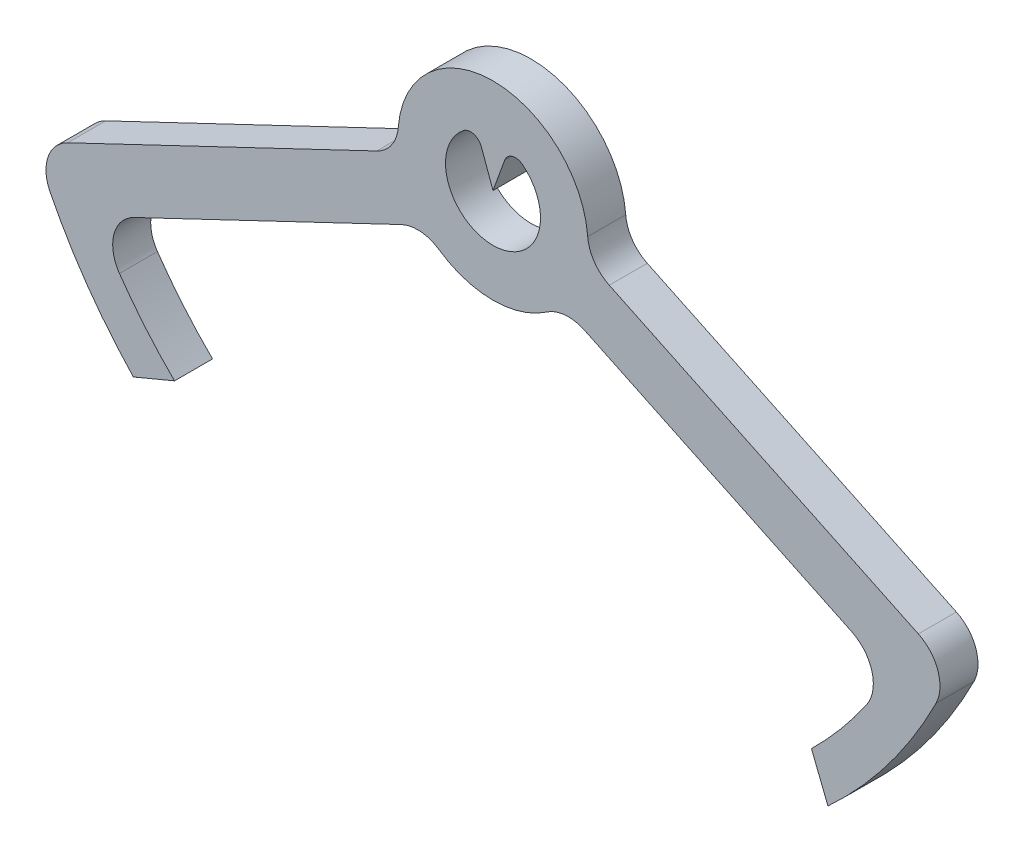
ISO-10303-21;
HEADER;
FILE_DESCRIPTION(('STEP AP214'),'2;1');
FILE_NAME('part.step','',(''),(''),'','','');
FILE_SCHEMA(('AUTOMOTIVE_DESIGN { 1 0 10303 214 1 1 1 1 }'));
ENDSEC;
DATA;
#1=APPLICATION_CONTEXT('core data for automotive mechanical design processes');
#2=APPLICATION_PROTOCOL_DEFINITION('international standard','automotive_design',2000,#1);
#3=PRODUCT_CONTEXT('',#1,'mechanical');
#4=PRODUCT('Part','Part','',(#3));
#5=PRODUCT_RELATED_PRODUCT_CATEGORY('part','',(#4));
#6=PRODUCT_DEFINITION_FORMATION('','',#4);
#7=PRODUCT_DEFINITION_CONTEXT('part definition',#1,'design');
#8=PRODUCT_DEFINITION('design','',#6,#7);
#9=PRODUCT_DEFINITION_SHAPE('','',#8);
#10=(LENGTH_UNIT() NAMED_UNIT(*) SI_UNIT(.MILLI.,.METRE.));
#11=(NAMED_UNIT(*) PLANE_ANGLE_UNIT() SI_UNIT($,.RADIAN.));
#12=(NAMED_UNIT(*) SI_UNIT($,.STERADIAN.) SOLID_ANGLE_UNIT());
#13=UNCERTAINTY_MEASURE_WITH_UNIT(LENGTH_MEASURE(1.E-05),#10,'distance_accuracy_value','');
#14=(GEOMETRIC_REPRESENTATION_CONTEXT(3) GLOBAL_UNCERTAINTY_ASSIGNED_CONTEXT((#13)) GLOBAL_UNIT_ASSIGNED_CONTEXT((#10,
#11,#12)) REPRESENTATION_CONTEXT('',''));
#15=CARTESIAN_POINT('',(0.,0.,0.));
#16=DIRECTION('',(0.,0.,1.));
#17=DIRECTION('',(1.,0.,0.));
#18=AXIS2_PLACEMENT_3D('',#15,#16,#17);
#19=CARTESIAN_POINT('',(0.,0.,10.));
#20=DIRECTION('',(0.,0.,-1.));
#21=DIRECTION('',(-1.,0.,0.));
#22=AXIS2_PLACEMENT_3D('',#19,#20,#21);
#23=CYLINDRICAL_SURFACE('',#22,12.5);
#24=CARTESIAN_POINT('',(0.,0.,10.));
#25=DIRECTION('',(0.,0.,1.));
#26=DIRECTION('',(1.,0.,0.));
#27=AXIS2_PLACEMENT_3D('',#24,#25,#26);
#28=CIRCLE('',#27,12.5);
#29=CARTESIAN_POINT('',(-7.76579706889906,9.79501893232876,10.));
#30=VERTEX_POINT('',#29);
#31=CARTESIAN_POINT('',(7.76579706889912,9.79501893232871,10.));
#32=VERTEX_POINT('',#31);
#33=EDGE_CURVE('E249',#30,#32,#28,.T.);
#34=ORIENTED_EDGE('',*,*,#33,.T.);
#35=DIRECTION('',(0.,0.,-1.));
#36=VECTOR('',#35,1.);
#37=CARTESIAN_POINT('',(7.76579706889912,9.79501893232871,10.));
#38=LINE('',#37,#36);
#39=CARTESIAN_POINT('',(7.76579706889912,9.79501893232871,0.));
#40=VERTEX_POINT('',#39);
#41=EDGE_CURVE('E377',#32,#40,#38,.T.);
#42=ORIENTED_EDGE('',*,*,#41,.T.);
#43=CARTESIAN_POINT('',(0.,0.,0.));
#44=DIRECTION('',(0.,0.,1.));
#45=DIRECTION('',(1.,0.,0.));
#46=AXIS2_PLACEMENT_3D('',#43,#44,#45);
#47=CIRCLE('',#46,12.5);
#48=CARTESIAN_POINT('',(-7.76579706889906,9.79501893232876,0.));
#49=VERTEX_POINT('',#48);
#50=EDGE_CURVE('E287',#49,#40,#47,.T.);
#51=ORIENTED_EDGE('',*,*,#50,.F.);
#52=DIRECTION('',(0.,0.,-1.));
#53=VECTOR('',#52,1.);
#54=CARTESIAN_POINT('',(-7.76579706889906,9.79501893232876,10.));
#55=LINE('',#54,#53);
#56=EDGE_CURVE('E375',#49,#30,#55,.F.);
#57=ORIENTED_EDGE('',*,*,#56,.T.);
#58=EDGE_LOOP('',(#34,#42,#51,#57));
#59=FACE_BOUND('',#58,.T.);
#60=ADVANCED_FACE('F34',(#59),#23,.F.);
#61=CARTESIAN_POINT('',(0.,0.,10.));
#62=DIRECTION('',(0.93969262078591,0.342020143325663,0.));
#63=DIRECTION('',(-0.342020143325663,0.939692620785911,0.));
#64=AXIS2_PLACEMENT_3D('',#61,#62,#63);
#65=PLANE('',#64);
#66=DIRECTION('',(0.342020143325663,-0.939692620785911,0.));
#67=VECTOR('',#66,1.);
#68=CARTESIAN_POINT('',(0.,0.,10.));
#69=LINE('',#68,#67);
#70=CARTESIAN_POINT('',(-3.08292791000555,8.47027481854685,10.));
#71=VERTEX_POINT('',#70);
#72=CARTESIAN_POINT('',(0.,0.,10.));
#73=VERTEX_POINT('',#72);
#74=EDGE_CURVE('E252',#71,#73,#69,.T.);
#75=ORIENTED_EDGE('',*,*,#74,.F.);
#76=DIRECTION('',(0.,0.,-1.));
#77=VECTOR('',#76,1.);
#78=CARTESIAN_POINT('',(-3.08292791000555,8.47027481854685,10.));
#79=LINE('',#78,#77);
#80=CARTESIAN_POINT('',(-3.08292791000555,8.47027481854685,0.));
#81=VERTEX_POINT('',#80);
#82=EDGE_CURVE('E382',#71,#81,#79,.T.);
#83=ORIENTED_EDGE('',*,*,#82,.T.);
#84=DIRECTION('',(0.342020143325663,-0.939692620785911,0.));
#85=VECTOR('',#84,1.);
#86=CARTESIAN_POINT('',(0.,0.,0.));
#87=LINE('',#86,#85);
#88=CARTESIAN_POINT('',(0.,0.,0.));
#89=VERTEX_POINT('',#88);
#90=EDGE_CURVE('E290',#81,#89,#87,.T.);
#91=ORIENTED_EDGE('',*,*,#90,.T.);
#92=DIRECTION('',(0.,0.,-1.));
#93=VECTOR('',#92,1.);
#94=CARTESIAN_POINT('',(0.,0.,10.));
#95=LINE('',#94,#93);
#96=EDGE_CURVE('E211',#73,#89,#95,.T.);
#97=ORIENTED_EDGE('',*,*,#96,.F.);
#98=EDGE_LOOP('',(#75,#83,#91,#97));
#99=FACE_BOUND('',#98,.T.);
#100=ADVANCED_FACE('F395',(#99),#65,.F.);
#101=CARTESIAN_POINT('',(3.22885710080164,-6.76937824490575,10.));
#102=DIRECTION('',(-0.430514280106884,0.90258376598743,0.));
#103=DIRECTION('',(-0.90258376598743,-0.430514280106884,0.));
#104=AXIS2_PLACEMENT_3D('',#101,#102,#103);
#105=PLANE('',#104);
#106=DIRECTION('',(0.90258376598743,0.430514280106884,0.));
#107=VECTOR('',#106,1.);
#108=CARTESIAN_POINT('',(3.22885710080164,-6.76937824490575,10.));
#109=LINE('',#108,#107);
#110=CARTESIAN_POINT('',(-94.3776142828172,-53.325699491744,10.));
#111=VERTEX_POINT('',#110);
#112=CARTESIAN_POINT('',(-24.1292593627974,-19.8186488591643,10.));
#113=VERTEX_POINT('',#112);
#114=EDGE_CURVE('E295',#111,#113,#109,.T.);
#115=ORIENTED_EDGE('',*,*,#114,.F.);
#116=DIRECTION('',(0.,0.,1.));
#117=VECTOR('',#116,1.);
#118=CARTESIAN_POINT('',(-94.3776142828172,-53.325699491744,0.));
#119=LINE('',#118,#117);
#120=CARTESIAN_POINT('',(-94.3776142828172,-53.325699491744,0.));
#121=VERTEX_POINT('',#120);
#122=EDGE_CURVE('E358',#111,#121,#119,.F.);
#123=ORIENTED_EDGE('',*,*,#122,.T.);
#124=DIRECTION('',(0.90258376598743,0.430514280106884,0.));
#125=VECTOR('',#124,1.);
#126=CARTESIAN_POINT('',(3.22885710080164,-6.76937824490575,0.));
#127=LINE('',#126,#125);
#128=CARTESIAN_POINT('',(-24.1292593627974,-19.8186488591643,0.));
#129=VERTEX_POINT('',#128);
#130=EDGE_CURVE('E258',#121,#129,#127,.T.);
#131=ORIENTED_EDGE('',*,*,#130,.T.);
#132=DIRECTION('',(0.,0.,1.));
#133=VECTOR('',#132,1.);
#134=CARTESIAN_POINT('',(-24.1292593627974,-19.8186488591643,10.));
#135=LINE('',#134,#133);
#136=EDGE_CURVE('E307',#129,#113,#135,.T.);
#137=ORIENTED_EDGE('',*,*,#136,.T.);
#138=EDGE_LOOP('',(#115,#123,#131,#137));
#139=FACE_BOUND('',#138,.T.);
#140=ADVANCED_FACE('F418',(#139),#105,.F.);
#141=CARTESIAN_POINT('',(0.,0.,10.));
#142=DIRECTION('',(0.,0.,-1.));
#143=DIRECTION('',(-1.,0.,0.));
#144=AXIS2_PLACEMENT_3D('',#141,#142,#143);
#145=CYLINDRICAL_SURFACE('',#144,25.);
#146=CARTESIAN_POINT('',(0.,0.,10.));
#147=DIRECTION('',(0.,0.,1.));
#148=DIRECTION('',(1.,0.,0.));
#149=AXIS2_PLACEMENT_3D('',#146,#147,#148);
#150=CIRCLE('',#149,25.);
#151=CARTESIAN_POINT('',(-14.1600832583775,-20.6032046564562,10.));
#152=VERTEX_POINT('',#151);
#153=CARTESIAN_POINT('',(14.1600832583774,-20.6032046564562,10.));
#154=VERTEX_POINT('',#153);
#155=EDGE_CURVE('E229',#152,#154,#150,.T.);
#156=ORIENTED_EDGE('',*,*,#155,.F.);
#157=DIRECTION('',(0.,0.,-1.));
#158=VECTOR('',#157,1.);
#159=CARTESIAN_POINT('',(-14.1600832583775,-20.6032046564562,10.));
#160=LINE('',#159,#158);
#161=CARTESIAN_POINT('',(-14.1600832583775,-20.6032046564562,0.));
#162=VERTEX_POINT('',#161);
#163=EDGE_CURVE('E304',#152,#162,#160,.T.);
#164=ORIENTED_EDGE('',*,*,#163,.T.);
#165=CARTESIAN_POINT('',(0.,0.,0.));
#166=DIRECTION('',(0.,0.,1.));
#167=DIRECTION('',(1.,0.,0.));
#168=AXIS2_PLACEMENT_3D('',#165,#166,#167);
#169=CIRCLE('',#168,25.);
#170=CARTESIAN_POINT('',(14.1600832583774,-20.6032046564562,0.));
#171=VERTEX_POINT('',#170);
#172=EDGE_CURVE('E260',#162,#171,#169,.T.);
#173=ORIENTED_EDGE('',*,*,#172,.T.);
#174=DIRECTION('',(0.,0.,-1.));
#175=VECTOR('',#174,1.);
#176=CARTESIAN_POINT('',(14.1600832583774,-20.6032046564562,10.));
#177=LINE('',#176,#175);
#178=EDGE_CURVE('E298',#171,#154,#177,.F.);
#179=ORIENTED_EDGE('',*,*,#178,.T.);
#180=EDGE_LOOP('',(#156,#164,#173,#179));
#181=FACE_BOUND('',#180,.T.);
#182=ADVANCED_FACE('F443',(#181),#145,.T.);
#183=CARTESIAN_POINT('',(-3.22885710080168,-6.76937824490571,10.));
#184=DIRECTION('',(0.43051428010689,0.902583765987427,0.));
#185=DIRECTION('',(-0.902583765987427,0.43051428010689,0.));
#186=AXIS2_PLACEMENT_3D('',#183,#184,#185);
#187=PLANE('',#186);
#188=DIRECTION('',(0.902583765987427,-0.43051428010689,0.));
#189=VECTOR('',#188,1.);
#190=CARTESIAN_POINT('',(-3.22885710080168,-6.76937824490571,0.));
#191=LINE('',#190,#189);
#192=CARTESIAN_POINT('',(24.1292593627972,-19.8186488591645,0.));
#193=VERTEX_POINT('',#192);
#194=CARTESIAN_POINT('',(94.3776142828168,-53.3256994917446,0.));
#195=VERTEX_POINT('',#194);
#196=EDGE_CURVE('E266',#193,#195,#191,.T.);
#197=ORIENTED_EDGE('',*,*,#196,.T.);
#198=DIRECTION('',(0.,0.,-1.));
#199=VECTOR('',#198,1.);
#200=CARTESIAN_POINT('',(94.3776142828168,-53.3256994917446,10.));
#201=LINE('',#200,#199);
#202=CARTESIAN_POINT('',(94.3776142828168,-53.3256994917446,10.));
#203=VERTEX_POINT('',#202);
#204=EDGE_CURVE('E356',#195,#203,#201,.F.);
#205=ORIENTED_EDGE('',*,*,#204,.T.);
#206=DIRECTION('',(0.902583765987427,-0.43051428010689,0.));
#207=VECTOR('',#206,1.);
#208=CARTESIAN_POINT('',(-3.22885710080168,-6.76937824490571,10.));
#209=LINE('',#208,#207);
#210=CARTESIAN_POINT('',(24.1292593627972,-19.8186488591645,10.));
#211=VERTEX_POINT('',#210);
#212=EDGE_CURVE('E227',#211,#203,#209,.T.);
#213=ORIENTED_EDGE('',*,*,#212,.F.);
#214=DIRECTION('',(0.,0.,1.));
#215=VECTOR('',#214,1.);
#216=CARTESIAN_POINT('',(24.1292593627972,-19.8186488591645,0.));
#217=LINE('',#216,#215);
#218=EDGE_CURVE('E310',#211,#193,#217,.F.);
#219=ORIENTED_EDGE('',*,*,#218,.T.);
#220=EDGE_LOOP('',(#197,#205,#213,#219));
#221=FACE_BOUND('',#220,.T.);
#222=ADVANCED_FACE('F455',(#221),#187,.F.);
#223=CARTESIAN_POINT('',(0.,0.,10.));
#224=DIRECTION('',(0.,0.,-1.));
#225=DIRECTION('',(-1.,0.,0.));
#226=AXIS2_PLACEMENT_3D('',#223,#224,#225);
#227=CYLINDRICAL_SURFACE('',#226,119.548);
#228=CARTESIAN_POINT('',(0.,0.,10.));
#229=DIRECTION('',(0.,0.,1.));
#230=DIRECTION('',(1.,0.,0.));
#231=AXIS2_PLACEMENT_3D('',#228,#229,#230);
#232=CIRCLE('',#231,119.548);
#233=CARTESIAN_POINT('',(83.792,-85.2679602195338,10.));
#234=VERTEX_POINT('',#233);
#235=CARTESIAN_POINT('',(98.2946637154489,-68.0432464618408,10.));
#236=VERTEX_POINT('',#235);
#237=EDGE_CURVE('E205',#234,#236,#232,.T.);
#238=ORIENTED_EDGE('',*,*,#237,.T.);
#239=DIRECTION('',(0.,0.,-1.));
#240=VECTOR('',#239,1.);
#241=CARTESIAN_POINT('',(98.2946637154489,-68.0432464618408,10.));
#242=LINE('',#241,#240);
#243=CARTESIAN_POINT('',(98.2946637154489,-68.0432464618408,0.));
#244=VERTEX_POINT('',#243);
#245=EDGE_CURVE('E354',#236,#244,#242,.T.);
#246=ORIENTED_EDGE('',*,*,#245,.T.);
#247=CARTESIAN_POINT('',(0.,0.,0.));
#248=DIRECTION('',(0.,0.,1.));
#249=DIRECTION('',(1.,0.,0.));
#250=AXIS2_PLACEMENT_3D('',#247,#248,#249);
#251=CIRCLE('',#250,119.548);
#252=CARTESIAN_POINT('',(83.792,-85.2679602195338,0.));
#253=VERTEX_POINT('',#252);
#254=EDGE_CURVE('E208',#253,#244,#251,.T.);
#255=ORIENTED_EDGE('',*,*,#254,.F.);
#256=DIRECTION('',(0.,0.,-1.));
#257=VECTOR('',#256,1.);
#258=CARTESIAN_POINT('',(83.792,-85.2679602195338,10.));
#259=LINE('',#258,#257);
#260=EDGE_CURVE('E200',#234,#253,#259,.T.);
#261=ORIENTED_EDGE('',*,*,#260,.F.);
#262=EDGE_LOOP('',(#238,#246,#255,#261));
#263=FACE_BOUND('',#262,.T.);
#264=ADVANCED_FACE('F202',(#263),#227,.F.);
#265=CARTESIAN_POINT('',(43.0668062153489,17.1285523734378,10.));
#266=DIRECTION('',(0.929205277797289,0.369564002188611,0.));
#267=DIRECTION('',(-0.369564002188611,0.929205277797289,0.));
#268=AXIS2_PLACEMENT_3D('',#265,#266,#267);
#269=PLANE('',#268);
#270=DIRECTION('',(0.369564002188611,-0.929205277797289,0.));
#271=VECTOR('',#270,1.);
#272=CARTESIAN_POINT('',(43.0668062153489,17.1285523734378,0.));
#273=LINE('',#272,#271);
#274=CARTESIAN_POINT('',(88.1317794736216,-96.1795911345693,0.));
#275=VERTEX_POINT('',#274);
#276=EDGE_CURVE('E270',#253,#275,#273,.T.);
#277=ORIENTED_EDGE('',*,*,#276,.T.);
#278=DIRECTION('',(0.,0.,-1.));
#279=VECTOR('',#278,1.);
#280=CARTESIAN_POINT('',(88.1317794736216,-96.1795911345693,10.));
#281=LINE('',#280,#279);
#282=CARTESIAN_POINT('',(88.1317794736216,-96.1795911345693,10.));
#283=VERTEX_POINT('',#282);
#284=EDGE_CURVE('E212',#283,#275,#281,.T.);
#285=ORIENTED_EDGE('',*,*,#284,.F.);
#286=DIRECTION('',(0.369564002188611,-0.929205277797289,0.));
#287=VECTOR('',#286,1.);
#288=CARTESIAN_POINT('',(43.0668062153489,17.1285523734378,10.));
#289=LINE('',#288,#287);
#290=EDGE_CURVE('E215',#234,#283,#289,.T.);
#291=ORIENTED_EDGE('',*,*,#290,.F.);
#292=ORIENTED_EDGE('',*,*,#260,.T.);
#293=EDGE_LOOP('',(#277,#285,#291,#292));
#294=FACE_BOUND('',#293,.T.);
#295=ADVANCED_FACE('F216',(#294),#269,.F.);
#296=CARTESIAN_POINT('',(0.,0.,10.));
#297=DIRECTION('',(0.,0.,-1.));
#298=DIRECTION('',(-1.,0.,0.));
#299=AXIS2_PLACEMENT_3D('',#296,#297,#298);
#300=CYLINDRICAL_SURFACE('',#299,130.452);
#301=CARTESIAN_POINT('',(0.,0.,0.));
#302=DIRECTION('',(0.,0.,1.));
#303=DIRECTION('',(1.,0.,0.));
#304=AXIS2_PLACEMENT_3D('',#301,#302,#303);
#305=CIRCLE('',#304,130.452);
#306=CARTESIAN_POINT('',(116.552854457499,-58.5931431296278,0.));
#307=VERTEX_POINT('',#306);
#308=EDGE_CURVE('E272',#275,#307,#305,.T.);
#309=ORIENTED_EDGE('',*,*,#308,.T.);
#310=DIRECTION('',(0.,0.,-1.));
#311=VECTOR('',#310,1.);
#312=CARTESIAN_POINT('',(116.552854457499,-58.5931431296278,10.));
#313=LINE('',#312,#311);
#314=CARTESIAN_POINT('',(116.552854457499,-58.5931431296278,10.));
#315=VERTEX_POINT('',#314);
#316=EDGE_CURVE('E348',#307,#315,#313,.F.);
#317=ORIENTED_EDGE('',*,*,#316,.T.);
#318=CARTESIAN_POINT('',(0.,0.,10.));
#319=DIRECTION('',(0.,0.,1.));
#320=DIRECTION('',(1.,0.,0.));
#321=AXIS2_PLACEMENT_3D('',#318,#319,#320);
#322=CIRCLE('',#321,130.452);
#323=EDGE_CURVE('E221',#283,#315,#322,.T.);
#324=ORIENTED_EDGE('',*,*,#323,.F.);
#325=ORIENTED_EDGE('',*,*,#284,.T.);
#326=EDGE_LOOP('',(#309,#317,#324,#325));
#327=FACE_BOUND('',#326,.T.);
#328=ADVANCED_FACE('F446',(#327),#300,.T.);
#329=CARTESIAN_POINT('',(3.22885710080168,6.7693782449057,10.));
#330=DIRECTION('',(0.43051428010689,0.902583765987427,0.));
#331=DIRECTION('',(-0.902583765987427,0.43051428010689,0.));
#332=AXIS2_PLACEMENT_3D('',#329,#330,#331);
#333=PLANE('',#332);
#334=DIRECTION('',(0.902583765987427,-0.43051428010689,0.));
#335=VECTOR('',#334,1.);
#336=CARTESIAN_POINT('',(3.22885710080168,6.7693782449057,10.));
#337=LINE('',#336,#335);
#338=CARTESIAN_POINT('',(30.5869735644006,-6.27989236935308,10.));
#339=VERTEX_POINT('',#338);
#340=CARTESIAN_POINT('',(111.923457776038,-45.0757573808298,10.));
#341=VERTEX_POINT('',#340);
#342=EDGE_CURVE('E234',#339,#341,#337,.T.);
#343=ORIENTED_EDGE('',*,*,#342,.T.);
#344=DIRECTION('',(0.,0.,1.));
#345=VECTOR('',#344,1.);
#346=CARTESIAN_POINT('',(111.923457776038,-45.0757573808298,0.));
#347=LINE('',#346,#345);
#348=CARTESIAN_POINT('',(111.923457776038,-45.0757573808298,0.));
#349=VERTEX_POINT('',#348);
#350=EDGE_CURVE('E341',#341,#349,#347,.F.);
#351=ORIENTED_EDGE('',*,*,#350,.T.);
#352=DIRECTION('',(0.902583765987427,-0.43051428010689,0.));
#353=VECTOR('',#352,1.);
#354=CARTESIAN_POINT('',(3.22885710080168,6.7693782449057,0.));
#355=LINE('',#354,#353);
#356=CARTESIAN_POINT('',(30.5869735644006,-6.27989236935308,0.));
#357=VERTEX_POINT('',#356);
#358=EDGE_CURVE('E265',#357,#349,#355,.T.);
#359=ORIENTED_EDGE('',*,*,#358,.F.);
#360=DIRECTION('',(0.,0.,-1.));
#361=VECTOR('',#360,1.);
#362=CARTESIAN_POINT('',(30.5869735644006,-6.27989236935308,10.));
#363=LINE('',#362,#361);
#364=EDGE_CURVE('E318',#357,#339,#363,.F.);
#365=ORIENTED_EDGE('',*,*,#364,.T.);
#366=EDGE_LOOP('',(#343,#351,#359,#365));
#367=FACE_BOUND('',#366,.T.);
#368=ADVANCED_FACE('F441',(#367),#333,.T.);
#369=CARTESIAN_POINT('',(24.9229402610496,1.96138949322942,10.));
#370=VERTEX_POINT('',#369);
#371=CARTESIAN_POINT('',(-24.9229402610496,1.96138949322959,10.));
#372=VERTEX_POINT('',#371);
#373=EDGE_CURVE('E237',#370,#372,#150,.T.);
#374=ORIENTED_EDGE('',*,*,#373,.F.);
#375=DIRECTION('',(0.,0.,-1.));
#376=VECTOR('',#375,1.);
#377=CARTESIAN_POINT('',(24.9229402610496,1.96138949322942,10.));
#378=LINE('',#377,#376);
#379=CARTESIAN_POINT('',(24.9229402610496,1.96138949322942,0.));
#380=VERTEX_POINT('',#379);
#381=EDGE_CURVE('E315',#370,#380,#378,.T.);
#382=ORIENTED_EDGE('',*,*,#381,.T.);
#383=CARTESIAN_POINT('',(-24.9229402610496,1.96138949322959,0.));
#384=VERTEX_POINT('',#383);
#385=EDGE_CURVE('E261',#380,#384,#169,.T.);
#386=ORIENTED_EDGE('',*,*,#385,.T.);
#387=DIRECTION('',(0.,0.,-1.));
#388=VECTOR('',#387,1.);
#389=CARTESIAN_POINT('',(-24.9229402610496,1.96138949322959,10.));
#390=LINE('',#389,#388);
#391=EDGE_CURVE('E313',#384,#372,#390,.F.);
#392=ORIENTED_EDGE('',*,*,#391,.T.);
#393=EDGE_LOOP('',(#374,#382,#386,#392));
#394=FACE_BOUND('',#393,.T.);
#395=ADVANCED_FACE('F437',(#394),#145,.T.);
#396=CARTESIAN_POINT('',(-3.22885710080163,6.76937824490572,10.));
#397=DIRECTION('',(-0.430514280106884,0.90258376598743,0.));
#398=DIRECTION('',(-0.90258376598743,-0.430514280106884,0.));
#399=AXIS2_PLACEMENT_3D('',#396,#397,#398);
#400=PLANE('',#399);
#401=DIRECTION('',(0.90258376598743,0.430514280106884,0.));
#402=VECTOR('',#401,1.);
#403=CARTESIAN_POINT('',(-3.22885710080163,6.76937824490572,0.));
#404=LINE('',#403,#402);
#405=CARTESIAN_POINT('',(-111.923457776038,-45.0757573808291,0.));
#406=VERTEX_POINT('',#405);
#407=CARTESIAN_POINT('',(-30.5869735644006,-6.27989236935288,0.));
#408=VERTEX_POINT('',#407);
#409=EDGE_CURVE('E264',#406,#408,#404,.T.);
#410=ORIENTED_EDGE('',*,*,#409,.F.);
#411=DIRECTION('',(0.,0.,-1.));
#412=VECTOR('',#411,1.);
#413=CARTESIAN_POINT('',(-111.923457776038,-45.0757573808291,10.));
#414=LINE('',#413,#412);
#415=CARTESIAN_POINT('',(-111.923457776038,-45.0757573808291,10.));
#416=VERTEX_POINT('',#415);
#417=EDGE_CURVE('E366',#406,#416,#414,.F.);
#418=ORIENTED_EDGE('',*,*,#417,.T.);
#419=DIRECTION('',(0.90258376598743,0.430514280106884,0.));
#420=VECTOR('',#419,1.);
#421=CARTESIAN_POINT('',(-3.22885710080163,6.76937824490572,10.));
#422=LINE('',#421,#420);
#423=CARTESIAN_POINT('',(-30.5869735644006,-6.27989236935288,10.));
#424=VERTEX_POINT('',#423);
#425=EDGE_CURVE('E238',#416,#424,#422,.T.);
#426=ORIENTED_EDGE('',*,*,#425,.T.);
#427=DIRECTION('',(0.,0.,-1.));
#428=VECTOR('',#427,1.);
#429=CARTESIAN_POINT('',(-30.5869735644006,-6.27989236935287,10.));
#430=LINE('',#429,#428);
#431=EDGE_CURVE('E320',#424,#408,#430,.T.);
#432=ORIENTED_EDGE('',*,*,#431,.T.);
#433=EDGE_LOOP('',(#410,#418,#426,#432));
#434=FACE_BOUND('',#433,.T.);
#435=ADVANCED_FACE('F433',(#434),#400,.T.);
#436=CARTESIAN_POINT('',(0.,0.,10.));
#437=DIRECTION('',(0.,0.,-1.));
#438=DIRECTION('',(-1.,0.,0.));
#439=AXIS2_PLACEMENT_3D('',#436,#437,#438);
#440=CYLINDRICAL_SURFACE('',#439,130.452);
#441=CARTESIAN_POINT('',(0.,0.,10.));
#442=DIRECTION('',(0.,0.,1.));
#443=DIRECTION('',(1.,0.,0.));
#444=AXIS2_PLACEMENT_3D('',#441,#442,#443);
#445=CIRCLE('',#444,130.452);
#446=CARTESIAN_POINT('',(-94.6261974750139,-89.7975893630763,10.));
#447=VERTEX_POINT('',#446);
#448=CARTESIAN_POINT('',(-116.552854457499,-58.593143129627,10.));
#449=VERTEX_POINT('',#448);
#450=EDGE_CURVE('E240',#447,#449,#445,.F.);
#451=ORIENTED_EDGE('',*,*,#450,.T.);
#452=DIRECTION('',(0.,0.,-1.));
#453=VECTOR('',#452,1.);
#454=CARTESIAN_POINT('',(-116.552854457499,-58.593143129627,10.));
#455=LINE('',#454,#453);
#456=CARTESIAN_POINT('',(-116.552854457499,-58.593143129627,0.));
#457=VERTEX_POINT('',#456);
#458=EDGE_CURVE('E363',#449,#457,#455,.T.);
#459=ORIENTED_EDGE('',*,*,#458,.T.);
#460=CARTESIAN_POINT('',(0.,0.,0.));
#461=DIRECTION('',(0.,0.,1.));
#462=DIRECTION('',(1.,0.,0.));
#463=AXIS2_PLACEMENT_3D('',#460,#461,#462);
#464=CIRCLE('',#463,130.452);
#465=CARTESIAN_POINT('',(-94.6261974750139,-89.7975893630763,0.));
#466=VERTEX_POINT('',#465);
#467=EDGE_CURVE('E278',#466,#457,#464,.F.);
#468=ORIENTED_EDGE('',*,*,#467,.F.);
#469=DIRECTION('',(0.,0.,-1.));
#470=VECTOR('',#469,1.);
#471=CARTESIAN_POINT('',(-94.6261974750139,-89.7975893630763,10.));
#472=LINE('',#471,#470);
#473=EDGE_CURVE('E300',#447,#466,#472,.T.);
#474=ORIENTED_EDGE('',*,*,#473,.F.);
#475=EDGE_LOOP('',(#451,#459,#468,#474));
#476=FACE_BOUND('',#475,.T.);
#477=ADVANCED_FACE('F429',(#476),#440,.T.);
#478=CARTESIAN_POINT('',(17.8778646447378,-42.7611863697028,10.));
#479=DIRECTION('',(0.385731091842964,-0.922611253337848,0.));
#480=DIRECTION('',(0.922611253337848,0.385731091842964,0.));
#481=AXIS2_PLACEMENT_3D('',#478,#479,#480);
#482=PLANE('',#481);
#483=DIRECTION('',(-0.922611253337848,-0.385731091842964,0.));
#484=VECTOR('',#483,1.);
#485=CARTESIAN_POINT('',(17.8778646447378,-42.7611863697028,0.));
#486=LINE('',#485,#484);
#487=CARTESIAN_POINT('',(-83.792,-85.2679602195338,0.));
#488=VERTEX_POINT('',#487);
#489=EDGE_CURVE('E281',#488,#466,#486,.T.);
#490=ORIENTED_EDGE('',*,*,#489,.F.);
#491=DIRECTION('',(0.,0.,-1.));
#492=VECTOR('',#491,1.);
#493=CARTESIAN_POINT('',(-83.792,-85.2679602195338,10.));
#494=LINE('',#493,#492);
#495=CARTESIAN_POINT('',(-83.792,-85.2679602195338,10.));
#496=VERTEX_POINT('',#495);
#497=EDGE_CURVE('E257',#496,#488,#494,.T.);
#498=ORIENTED_EDGE('',*,*,#497,.F.);
#499=DIRECTION('',(-0.922611253337848,-0.385731091842964,0.));
#500=VECTOR('',#499,1.);
#501=CARTESIAN_POINT('',(17.8778646447378,-42.7611863697028,10.));
#502=LINE('',#501,#500);
#503=EDGE_CURVE('E243',#496,#447,#502,.T.);
#504=ORIENTED_EDGE('',*,*,#503,.T.);
#505=ORIENTED_EDGE('',*,*,#473,.T.);
#506=EDGE_LOOP('',(#490,#498,#504,#505));
#507=FACE_BOUND('',#506,.T.);
#508=ADVANCED_FACE('F425',(#507),#482,.T.);
#509=CARTESIAN_POINT('',(0.,0.,10.));
#510=DIRECTION('',(0.,0.,-1.));
#511=DIRECTION('',(-1.,0.,0.));
#512=AXIS2_PLACEMENT_3D('',#509,#510,#511);
#513=CYLINDRICAL_SURFACE('',#512,119.548);
#514=CARTESIAN_POINT('',(0.,0.,0.));
#515=DIRECTION('',(0.,0.,1.));
#516=DIRECTION('',(1.,0.,0.));
#517=AXIS2_PLACEMENT_3D('',#514,#515,#516);
#518=CIRCLE('',#517,119.548);
#519=CARTESIAN_POINT('',(-98.2946637154494,-68.0432464618401,0.));
#520=VERTEX_POINT('',#519);
#521=EDGE_CURVE('E284',#488,#520,#518,.F.);
#522=ORIENTED_EDGE('',*,*,#521,.T.);
#523=DIRECTION('',(0.,0.,-1.));
#524=VECTOR('',#523,1.);
#525=CARTESIAN_POINT('',(-98.2946637154494,-68.0432464618401,10.));
#526=LINE('',#525,#524);
#527=CARTESIAN_POINT('',(-98.2946637154494,-68.0432464618401,10.));
#528=VERTEX_POINT('',#527);
#529=EDGE_CURVE('E361',#520,#528,#526,.F.);
#530=ORIENTED_EDGE('',*,*,#529,.T.);
#531=CARTESIAN_POINT('',(0.,0.,10.));
#532=DIRECTION('',(0.,0.,1.));
#533=DIRECTION('',(1.,0.,0.));
#534=AXIS2_PLACEMENT_3D('',#531,#532,#533);
#535=CIRCLE('',#534,119.548);
#536=EDGE_CURVE('E246',#496,#528,#535,.F.);
#537=ORIENTED_EDGE('',*,*,#536,.F.);
#538=ORIENTED_EDGE('',*,*,#497,.T.);
#539=EDGE_LOOP('',(#522,#530,#537,#538));
#540=FACE_BOUND('',#539,.T.);
#541=ADVANCED_FACE('F422',(#540),#513,.F.);
#542=CARTESIAN_POINT('',(0.,0.,10.));
#543=DIRECTION('',(-0.939692620785908,0.342020143325669,0.));
#544=DIRECTION('',(-0.342020143325669,-0.939692620785908,0.));
#545=AXIS2_PLACEMENT_3D('',#542,#543,#544);
#546=PLANE('',#545);
#547=DIRECTION('',(0.342020143325669,0.939692620785908,0.));
#548=VECTOR('',#547,1.);
#549=CARTESIAN_POINT('',(0.,0.,0.));
#550=LINE('',#549,#548);
#551=CARTESIAN_POINT('',(3.08292791000561,8.47027481854682,0.));
#552=VERTEX_POINT('',#551);
#553=EDGE_CURVE('E292',#89,#552,#550,.T.);
#554=ORIENTED_EDGE('',*,*,#553,.T.);
#555=DIRECTION('',(0.,0.,-1.));
#556=VECTOR('',#555,1.);
#557=CARTESIAN_POINT('',(3.08292791000561,8.47027481854682,10.));
#558=LINE('',#557,#556);
#559=CARTESIAN_POINT('',(3.08292791000561,8.47027481854682,10.));
#560=VERTEX_POINT('',#559);
#561=EDGE_CURVE('E380',#552,#560,#558,.F.);
#562=ORIENTED_EDGE('',*,*,#561,.T.);
#563=DIRECTION('',(0.342020143325669,0.939692620785908,0.));
#564=VECTOR('',#563,1.);
#565=CARTESIAN_POINT('',(0.,0.,10.));
#566=LINE('',#565,#564);
#567=EDGE_CURVE('E254',#73,#560,#566,.T.);
#568=ORIENTED_EDGE('',*,*,#567,.F.);
#569=ORIENTED_EDGE('',*,*,#96,.T.);
#570=EDGE_LOOP('',(#554,#562,#568,#569));
#571=FACE_BOUND('',#570,.T.);
#572=ADVANCED_FACE('F400',(#571),#546,.F.);
#573=CARTESIAN_POINT('',(0.,0.,10.));
#574=DIRECTION('',(0.,0.,1.));
#575=DIRECTION('',(1.,0.,0.));
#576=AXIS2_PLACEMENT_3D('',#573,#574,#575);
#577=PLANE('',#576);
#578=ORIENTED_EDGE('',*,*,#323,.T.);
#579=CARTESIAN_POINT('',(107.618314974969,-54.1015950407041,10.));
#580=DIRECTION('',(0.,0.,1.));
#581=DIRECTION('',(1.,0.,0.));
#582=AXIS2_PLACEMENT_3D('',#579,#580,#581);
#583=CIRCLE('',#582,10.);
#584=EDGE_CURVE('E352',#315,#341,#583,.T.);
#585=ORIENTED_EDGE('',*,*,#584,.T.);
#586=ORIENTED_EDGE('',*,*,#342,.F.);
#587=CARTESIAN_POINT('',(34.8921163654695,2.74594529052119,10.));
#588=DIRECTION('',(0.,0.,1.));
#589=DIRECTION('',(1.,0.,0.));
#590=AXIS2_PLACEMENT_3D('',#587,#588,#589);
#591=CIRCLE('',#590,10.);
#592=EDGE_CURVE('E334',#339,#370,#591,.F.);
#593=ORIENTED_EDGE('',*,*,#592,.T.);
#594=ORIENTED_EDGE('',*,*,#373,.T.);
#595=CARTESIAN_POINT('',(-34.8921163654695,2.74594529052142,10.));
#596=DIRECTION('',(0.,0.,1.));
#597=DIRECTION('',(1.,0.,0.));
#598=AXIS2_PLACEMENT_3D('',#595,#596,#597);
#599=CIRCLE('',#598,10.);
#600=EDGE_CURVE('E338',#372,#424,#599,.F.);
#601=ORIENTED_EDGE('',*,*,#600,.T.);
#602=ORIENTED_EDGE('',*,*,#425,.F.);
#603=CARTESIAN_POINT('',(-107.618314974969,-54.1015950407034,10.));
#604=DIRECTION('',(0.,0.,1.));
#605=DIRECTION('',(1.,0.,0.));
#606=AXIS2_PLACEMENT_3D('',#603,#604,#605);
#607=CIRCLE('',#606,10.);
#608=EDGE_CURVE('E350',#416,#449,#607,.T.);
#609=ORIENTED_EDGE('',*,*,#608,.T.);
#610=ORIENTED_EDGE('',*,*,#450,.F.);
#611=ORIENTED_EDGE('',*,*,#503,.F.);
#612=ORIENTED_EDGE('',*,*,#536,.T.);
#613=CARTESIAN_POINT('',(-90.0724714817484,-62.3515371516183,10.));
#614=DIRECTION('',(0.,0.,1.));
#615=DIRECTION('',(1.,0.,0.));
#616=AXIS2_PLACEMENT_3D('',#613,#614,#615);
#617=CIRCLE('',#616,10.);
#618=EDGE_CURVE('E373',#528,#111,#617,.F.);
#619=ORIENTED_EDGE('',*,*,#618,.T.);
#620=ORIENTED_EDGE('',*,*,#114,.T.);
#621=CARTESIAN_POINT('',(-19.8241165617285,-28.8444865190386,10.));
#622=DIRECTION('',(0.,0.,1.));
#623=DIRECTION('',(1.,0.,0.));
#624=AXIS2_PLACEMENT_3D('',#621,#622,#623);
#625=CIRCLE('',#624,10.);
#626=EDGE_CURVE('E326',#113,#152,#625,.F.);
#627=ORIENTED_EDGE('',*,*,#626,.T.);
#628=ORIENTED_EDGE('',*,*,#155,.T.);
#629=CARTESIAN_POINT('',(19.8241165617283,-28.8444865190388,10.));
#630=DIRECTION('',(0.,0.,1.));
#631=DIRECTION('',(1.,0.,0.));
#632=AXIS2_PLACEMENT_3D('',#629,#630,#631);
#633=CIRCLE('',#632,10.);
#634=EDGE_CURVE('E330',#154,#211,#633,.F.);
#635=ORIENTED_EDGE('',*,*,#634,.T.);
#636=ORIENTED_EDGE('',*,*,#212,.T.);
#637=CARTESIAN_POINT('',(90.0724714817479,-62.3515371516189,10.));
#638=DIRECTION('',(0.,0.,1.));
#639=DIRECTION('',(1.,0.,0.));
#640=AXIS2_PLACEMENT_3D('',#637,#638,#639);
#641=CIRCLE('',#640,10.);
#642=EDGE_CURVE('E226',#203,#236,#641,.F.);
#643=ORIENTED_EDGE('',*,*,#642,.T.);
#644=ORIENTED_EDGE('',*,*,#237,.F.);
#645=ORIENTED_EDGE('',*,*,#290,.T.);
#646=EDGE_LOOP('',(#578,#585,#586,#593,#594,#601,#602,#609,#610,#611,#612,#619,#620,#627,#628,
#635,#636,#643,#644,#645));
#647=FACE_BOUND('',#646,.T.);
#648=ORIENTED_EDGE('',*,*,#33,.F.);
#649=CARTESIAN_POINT('',(-5.90200577236328,7.44421438856986,10.));
#650=DIRECTION('',(0.,0.,1.));
#651=DIRECTION('',(1.,0.,0.));
#652=AXIS2_PLACEMENT_3D('',#649,#650,#651);
#653=CIRCLE('',#652,3.);
#654=EDGE_CURVE('E11',#30,#71,#653,.F.);
#655=ORIENTED_EDGE('',*,*,#654,.T.);
#656=ORIENTED_EDGE('',*,*,#74,.T.);
#657=ORIENTED_EDGE('',*,*,#567,.T.);
#658=CARTESIAN_POINT('',(5.90200577236334,7.44421438856982,10.));
#659=DIRECTION('',(0.,0.,1.));
#660=DIRECTION('',(1.,0.,0.));
#661=AXIS2_PLACEMENT_3D('',#658,#659,#660);
#662=CIRCLE('',#661,3.);
#663=EDGE_CURVE('E386',#560,#32,#662,.F.);
#664=ORIENTED_EDGE('',*,*,#663,.T.);
#665=EDGE_LOOP('',(#648,#655,#656,#657,#664));
#666=FACE_BOUND('',#665,.T.);
#667=ADVANCED_FACE('F223',(#647,#666),#577,.T.);
#668=CARTESIAN_POINT('',(0.,0.,0.));
#669=DIRECTION('',(0.,0.,1.));
#670=DIRECTION('',(1.,0.,0.));
#671=AXIS2_PLACEMENT_3D('',#668,#669,#670);
#672=PLANE('',#671);
#673=ORIENTED_EDGE('',*,*,#358,.T.);
#674=CARTESIAN_POINT('',(107.618314974969,-54.1015950407041,0.));
#675=DIRECTION('',(0.,0.,1.));
#676=DIRECTION('',(1.,0.,0.));
#677=AXIS2_PLACEMENT_3D('',#674,#675,#676);
#678=CIRCLE('',#677,10.);
#679=EDGE_CURVE('E346',#349,#307,#678,.F.);
#680=ORIENTED_EDGE('',*,*,#679,.T.);
#681=ORIENTED_EDGE('',*,*,#308,.F.);
#682=ORIENTED_EDGE('',*,*,#276,.F.);
#683=ORIENTED_EDGE('',*,*,#254,.T.);
#684=CARTESIAN_POINT('',(90.0724714817479,-62.3515371516189,0.));
#685=DIRECTION('',(0.,0.,1.));
#686=DIRECTION('',(1.,0.,0.));
#687=AXIS2_PLACEMENT_3D('',#684,#685,#686);
#688=CIRCLE('',#687,10.);
#689=EDGE_CURVE('E368',#244,#195,#688,.T.);
#690=ORIENTED_EDGE('',*,*,#689,.T.);
#691=ORIENTED_EDGE('',*,*,#196,.F.);
#692=CARTESIAN_POINT('',(19.8241165617283,-28.8444865190388,0.));
#693=DIRECTION('',(0.,0.,1.));
#694=DIRECTION('',(1.,0.,0.));
#695=AXIS2_PLACEMENT_3D('',#692,#693,#694);
#696=CIRCLE('',#695,10.);
#697=EDGE_CURVE('E328',#193,#171,#696,.T.);
#698=ORIENTED_EDGE('',*,*,#697,.T.);
#699=ORIENTED_EDGE('',*,*,#172,.F.);
#700=CARTESIAN_POINT('',(-19.8241165617285,-28.8444865190386,0.));
#701=DIRECTION('',(0.,0.,1.));
#702=DIRECTION('',(1.,0.,0.));
#703=AXIS2_PLACEMENT_3D('',#700,#701,#702);
#704=CIRCLE('',#703,10.);
#705=EDGE_CURVE('E323',#162,#129,#704,.T.);
#706=ORIENTED_EDGE('',*,*,#705,.T.);
#707=ORIENTED_EDGE('',*,*,#130,.F.);
#708=CARTESIAN_POINT('',(-90.0724714817484,-62.3515371516183,0.));
#709=DIRECTION('',(0.,0.,1.));
#710=DIRECTION('',(1.,0.,0.));
#711=AXIS2_PLACEMENT_3D('',#708,#709,#710);
#712=CIRCLE('',#711,10.);
#713=EDGE_CURVE('E371',#121,#520,#712,.T.);
#714=ORIENTED_EDGE('',*,*,#713,.T.);
#715=ORIENTED_EDGE('',*,*,#521,.F.);
#716=ORIENTED_EDGE('',*,*,#489,.T.);
#717=ORIENTED_EDGE('',*,*,#467,.T.);
#718=CARTESIAN_POINT('',(-107.618314974969,-54.1015950407034,0.));
#719=DIRECTION('',(0.,0.,1.));
#720=DIRECTION('',(1.,0.,0.));
#721=AXIS2_PLACEMENT_3D('',#718,#719,#720);
#722=CIRCLE('',#721,10.);
#723=EDGE_CURVE('E344',#457,#406,#722,.F.);
#724=ORIENTED_EDGE('',*,*,#723,.T.);
#725=ORIENTED_EDGE('',*,*,#409,.T.);
#726=CARTESIAN_POINT('',(-34.8921163654695,2.74594529052142,0.));
#727=DIRECTION('',(0.,0.,1.));
#728=DIRECTION('',(1.,0.,0.));
#729=AXIS2_PLACEMENT_3D('',#726,#727,#728);
#730=CIRCLE('',#729,10.);
#731=EDGE_CURVE('E336',#408,#384,#730,.T.);
#732=ORIENTED_EDGE('',*,*,#731,.T.);
#733=ORIENTED_EDGE('',*,*,#385,.F.);
#734=CARTESIAN_POINT('',(34.8921163654695,2.74594529052119,0.));
#735=DIRECTION('',(0.,0.,1.));
#736=DIRECTION('',(1.,0.,0.));
#737=AXIS2_PLACEMENT_3D('',#734,#735,#736);
#738=CIRCLE('',#737,10.);
#739=EDGE_CURVE('E332',#380,#357,#738,.T.);
#740=ORIENTED_EDGE('',*,*,#739,.T.);
#741=EDGE_LOOP('',(#673,#680,#681,#682,#683,#690,#691,#698,#699,#706,#707,#714,#715,#716,#717,
#724,#725,#732,#733,#740));
#742=FACE_BOUND('',#741,.T.);
#743=ORIENTED_EDGE('',*,*,#90,.F.);
#744=CARTESIAN_POINT('',(-5.90200577236328,7.44421438856986,0.));
#745=DIRECTION('',(0.,0.,1.));
#746=DIRECTION('',(1.,0.,0.));
#747=AXIS2_PLACEMENT_3D('',#744,#745,#746);
#748=CIRCLE('',#747,3.);
#749=EDGE_CURVE('E42',#81,#49,#748,.T.);
#750=ORIENTED_EDGE('',*,*,#749,.T.);
#751=ORIENTED_EDGE('',*,*,#50,.T.);
#752=CARTESIAN_POINT('',(5.90200577236334,7.44421438856982,0.));
#753=DIRECTION('',(0.,0.,1.));
#754=DIRECTION('',(1.,0.,0.));
#755=AXIS2_PLACEMENT_3D('',#752,#753,#754);
#756=CIRCLE('',#755,3.);
#757=EDGE_CURVE('E384',#40,#552,#756,.T.);
#758=ORIENTED_EDGE('',*,*,#757,.T.);
#759=ORIENTED_EDGE('',*,*,#553,.F.);
#760=EDGE_LOOP('',(#743,#750,#751,#758,#759));
#761=FACE_BOUND('',#760,.T.);
#762=ADVANCED_FACE('F390',(#742,#761),#672,.F.);
#763=CARTESIAN_POINT('',(-19.8241165617285,-28.8444865190386,10.));
#764=DIRECTION('',(0.,0.,-1.));
#765=DIRECTION('',(-1.,0.,0.));
#766=AXIS2_PLACEMENT_3D('',#763,#764,#765);
#767=CYLINDRICAL_SURFACE('',#766,10.);
#768=ORIENTED_EDGE('',*,*,#626,.F.);
#769=ORIENTED_EDGE('',*,*,#136,.F.);
#770=ORIENTED_EDGE('',*,*,#705,.F.);
#771=ORIENTED_EDGE('',*,*,#163,.F.);
#772=EDGE_LOOP('',(#768,#769,#770,#771));
#773=FACE_BOUND('',#772,.T.);
#774=ADVANCED_FACE('F462',(#773),#767,.F.);
#775=CARTESIAN_POINT('',(19.8241165617283,-28.8444865190388,10.));
#776=DIRECTION('',(0.,0.,-1.));
#777=DIRECTION('',(-1.,0.,0.));
#778=AXIS2_PLACEMENT_3D('',#775,#776,#777);
#779=CYLINDRICAL_SURFACE('',#778,10.);
#780=ORIENTED_EDGE('',*,*,#634,.F.);
#781=ORIENTED_EDGE('',*,*,#178,.F.);
#782=ORIENTED_EDGE('',*,*,#697,.F.);
#783=ORIENTED_EDGE('',*,*,#218,.F.);
#784=EDGE_LOOP('',(#780,#781,#782,#783));
#785=FACE_BOUND('',#784,.T.);
#786=ADVANCED_FACE('F465',(#785),#779,.F.);
#787=CARTESIAN_POINT('',(34.8921163654695,2.74594529052119,10.));
#788=DIRECTION('',(0.,0.,-1.));
#789=DIRECTION('',(-1.,0.,0.));
#790=AXIS2_PLACEMENT_3D('',#787,#788,#789);
#791=CYLINDRICAL_SURFACE('',#790,10.);
#792=ORIENTED_EDGE('',*,*,#592,.F.);
#793=ORIENTED_EDGE('',*,*,#364,.F.);
#794=ORIENTED_EDGE('',*,*,#739,.F.);
#795=ORIENTED_EDGE('',*,*,#381,.F.);
#796=EDGE_LOOP('',(#792,#793,#794,#795));
#797=FACE_BOUND('',#796,.T.);
#798=ADVANCED_FACE('F469',(#797),#791,.F.);
#799=CARTESIAN_POINT('',(-34.8921163654695,2.74594529052142,10.));
#800=DIRECTION('',(0.,0.,-1.));
#801=DIRECTION('',(-1.,0.,0.));
#802=AXIS2_PLACEMENT_3D('',#799,#800,#801);
#803=CYLINDRICAL_SURFACE('',#802,10.);
#804=ORIENTED_EDGE('',*,*,#600,.F.);
#805=ORIENTED_EDGE('',*,*,#391,.F.);
#806=ORIENTED_EDGE('',*,*,#731,.F.);
#807=ORIENTED_EDGE('',*,*,#431,.F.);
#808=EDGE_LOOP('',(#804,#805,#806,#807));
#809=FACE_BOUND('',#808,.T.);
#810=ADVANCED_FACE('F473',(#809),#803,.F.);
#811=CARTESIAN_POINT('',(107.618314974969,-54.1015950407041,10.));
#812=DIRECTION('',(0.,0.,-1.));
#813=DIRECTION('',(-1.,0.,0.));
#814=AXIS2_PLACEMENT_3D('',#811,#812,#813);
#815=CYLINDRICAL_SURFACE('',#814,10.);
#816=ORIENTED_EDGE('',*,*,#584,.F.);
#817=ORIENTED_EDGE('',*,*,#316,.F.);
#818=ORIENTED_EDGE('',*,*,#679,.F.);
#819=ORIENTED_EDGE('',*,*,#350,.F.);
#820=EDGE_LOOP('',(#816,#817,#818,#819));
#821=FACE_BOUND('',#820,.T.);
#822=ADVANCED_FACE('F477',(#821),#815,.T.);
#823=CARTESIAN_POINT('',(90.0724714817479,-62.3515371516189,10.));
#824=DIRECTION('',(0.,0.,-1.));
#825=DIRECTION('',(-1.,0.,0.));
#826=AXIS2_PLACEMENT_3D('',#823,#824,#825);
#827=CYLINDRICAL_SURFACE('',#826,10.);
#828=ORIENTED_EDGE('',*,*,#642,.F.);
#829=ORIENTED_EDGE('',*,*,#204,.F.);
#830=ORIENTED_EDGE('',*,*,#689,.F.);
#831=ORIENTED_EDGE('',*,*,#245,.F.);
#832=EDGE_LOOP('',(#828,#829,#830,#831));
#833=FACE_BOUND('',#832,.T.);
#834=ADVANCED_FACE('F481',(#833),#827,.F.);
#835=CARTESIAN_POINT('',(-90.0724714817484,-62.3515371516183,10.));
#836=DIRECTION('',(0.,0.,-1.));
#837=DIRECTION('',(-1.,0.,0.));
#838=AXIS2_PLACEMENT_3D('',#835,#836,#837);
#839=CYLINDRICAL_SURFACE('',#838,10.);
#840=ORIENTED_EDGE('',*,*,#618,.F.);
#841=ORIENTED_EDGE('',*,*,#529,.F.);
#842=ORIENTED_EDGE('',*,*,#713,.F.);
#843=ORIENTED_EDGE('',*,*,#122,.F.);
#844=EDGE_LOOP('',(#840,#841,#842,#843));
#845=FACE_BOUND('',#844,.T.);
#846=ADVANCED_FACE('F410',(#845),#839,.F.);
#847=CARTESIAN_POINT('',(-107.618314974969,-54.1015950407034,10.));
#848=DIRECTION('',(0.,0.,-1.));
#849=DIRECTION('',(-1.,0.,0.));
#850=AXIS2_PLACEMENT_3D('',#847,#848,#849);
#851=CYLINDRICAL_SURFACE('',#850,10.);
#852=ORIENTED_EDGE('',*,*,#608,.F.);
#853=ORIENTED_EDGE('',*,*,#417,.F.);
#854=ORIENTED_EDGE('',*,*,#723,.F.);
#855=ORIENTED_EDGE('',*,*,#458,.F.);
#856=EDGE_LOOP('',(#852,#853,#854,#855));
#857=FACE_BOUND('',#856,.T.);
#858=ADVANCED_FACE('F405',(#857),#851,.T.);
#859=CARTESIAN_POINT('',(5.90200577236334,7.44421438856982,10.));
#860=DIRECTION('',(0.,0.,-1.));
#861=DIRECTION('',(-1.,0.,0.));
#862=AXIS2_PLACEMENT_3D('',#859,#860,#861);
#863=CYLINDRICAL_SURFACE('',#862,3.);
#864=ORIENTED_EDGE('',*,*,#663,.F.);
#865=ORIENTED_EDGE('',*,*,#561,.F.);
#866=ORIENTED_EDGE('',*,*,#757,.F.);
#867=ORIENTED_EDGE('',*,*,#41,.F.);
#868=EDGE_LOOP('',(#864,#865,#866,#867));
#869=FACE_BOUND('',#868,.T.);
#870=ADVANCED_FACE('F403',(#869),#863,.F.);
#871=CARTESIAN_POINT('',(-5.90200577236328,7.44421438856986,10.));
#872=DIRECTION('',(0.,0.,-1.));
#873=DIRECTION('',(-1.,0.,0.));
#874=AXIS2_PLACEMENT_3D('',#871,#872,#873);
#875=CYLINDRICAL_SURFACE('',#874,3.);
#876=ORIENTED_EDGE('',*,*,#654,.F.);
#877=ORIENTED_EDGE('',*,*,#56,.F.);
#878=ORIENTED_EDGE('',*,*,#749,.F.);
#879=ORIENTED_EDGE('',*,*,#82,.F.);
#880=EDGE_LOOP('',(#876,#877,#878,#879));
#881=FACE_BOUND('',#880,.T.);
#882=ADVANCED_FACE('F36',(#881),#875,.F.);
#883=CLOSED_SHELL('',(#60,#100,#140,#182,#222,#264,#295,#328,#368,#395,#435,#477,#508,#541,#572,
#667,#762,#774,#786,#798,#810,#822,#834,#846,#858,#870,#882));
#884=MANIFOLD_SOLID_BREP('B2',#883);
#885=ADVANCED_BREP_SHAPE_REPRESENTATION('',(#18,#884),#14);
#886=SHAPE_DEFINITION_REPRESENTATION(#9,#885);
ENDSEC;
END-ISO-10303-21;
